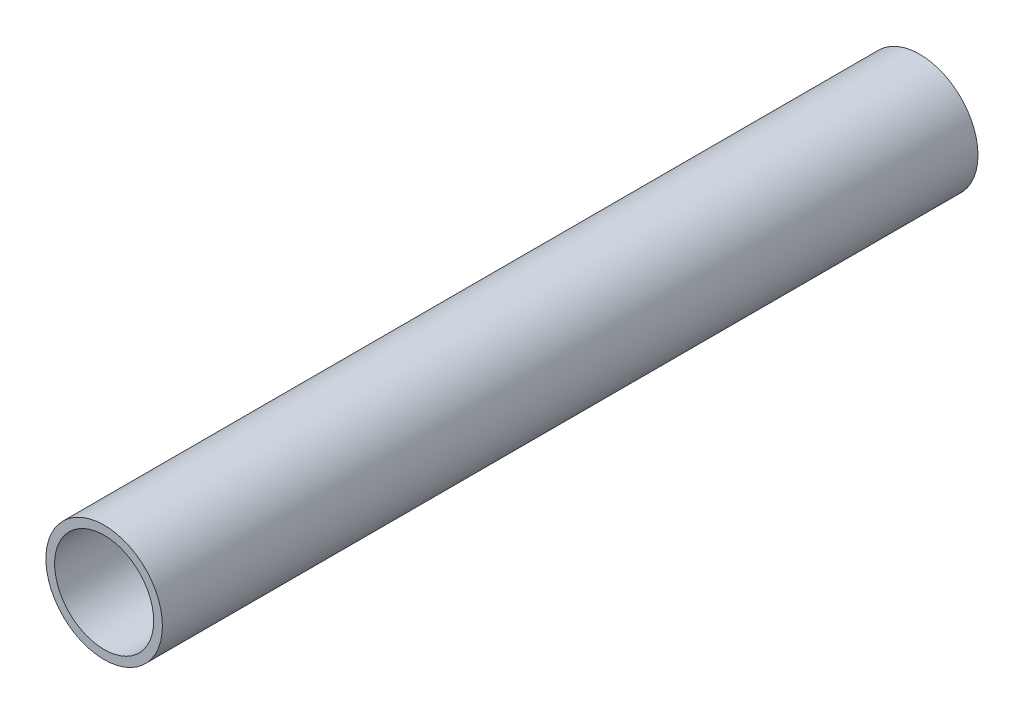
ISO-10303-21;
HEADER;
FILE_DESCRIPTION(('STEP AP214'),'2;1');
FILE_NAME('part.step','',(''),(''),'','','');
FILE_SCHEMA(('AUTOMOTIVE_DESIGN { 1 0 10303 214 1 1 1 1 }'));
ENDSEC;
DATA;
#1=APPLICATION_CONTEXT('core data for automotive mechanical design processes');
#2=APPLICATION_PROTOCOL_DEFINITION('international standard','automotive_design',2000,#1);
#3=PRODUCT_CONTEXT('',#1,'mechanical');
#4=PRODUCT('Part','Part','',(#3));
#5=PRODUCT_RELATED_PRODUCT_CATEGORY('part','',(#4));
#6=PRODUCT_DEFINITION_FORMATION('','',#4);
#7=PRODUCT_DEFINITION_CONTEXT('part definition',#1,'design');
#8=PRODUCT_DEFINITION('design','',#6,#7);
#9=PRODUCT_DEFINITION_SHAPE('','',#8);
#10=(LENGTH_UNIT() NAMED_UNIT(*) SI_UNIT(.MILLI.,.METRE.));
#11=(NAMED_UNIT(*) PLANE_ANGLE_UNIT() SI_UNIT($,.RADIAN.));
#12=(NAMED_UNIT(*) SI_UNIT($,.STERADIAN.) SOLID_ANGLE_UNIT());
#13=UNCERTAINTY_MEASURE_WITH_UNIT(LENGTH_MEASURE(1.E-05),#10,'distance_accuracy_value','');
#14=(GEOMETRIC_REPRESENTATION_CONTEXT(3) GLOBAL_UNCERTAINTY_ASSIGNED_CONTEXT((#13)) GLOBAL_UNIT_ASSIGNED_CONTEXT((#10,
#11,#12)) REPRESENTATION_CONTEXT('',''));
#15=CARTESIAN_POINT('',(0.,0.,0.));
#16=DIRECTION('',(0.,0.,1.));
#17=DIRECTION('',(1.,0.,0.));
#18=AXIS2_PLACEMENT_3D('',#15,#16,#17);
#19=CARTESIAN_POINT('',(0.,0.,140.));
#20=DIRECTION('',(0.,0.,1.));
#21=DIRECTION('',(1.,0.,0.));
#22=AXIS2_PLACEMENT_3D('',#19,#20,#21);
#23=PLANE('',#22);
#24=CARTESIAN_POINT('',(0.,0.,140.));
#25=DIRECTION('',(0.,0.,1.));
#26=DIRECTION('',(1.,0.,0.));
#27=AXIS2_PLACEMENT_3D('',#24,#25,#26);
#28=CIRCLE('',#27,10.);
#29=CARTESIAN_POINT('',(10.,0.,140.));
#30=VERTEX_POINT('',#29);
#31=EDGE_CURVE('E10',#30,#30,#28,.T.);
#32=ORIENTED_EDGE('',*,*,#31,.T.);
#33=EDGE_LOOP('',(#32));
#34=FACE_BOUND('',#33,.T.);
#35=CARTESIAN_POINT('',(0.,0.,140.));
#36=DIRECTION('',(0.,0.,1.));
#37=DIRECTION('',(1.,0.,0.));
#38=AXIS2_PLACEMENT_3D('',#35,#36,#37);
#39=CIRCLE('',#38,8.5);
#40=CARTESIAN_POINT('',(8.5,0.,140.));
#41=VERTEX_POINT('',#40);
#42=EDGE_CURVE('E42',#41,#41,#39,.T.);
#43=ORIENTED_EDGE('',*,*,#42,.F.);
#44=EDGE_LOOP('',(#43));
#45=FACE_BOUND('',#44,.T.);
#46=ADVANCED_FACE('F31',(#34,#45),#23,.T.);
#47=CARTESIAN_POINT('',(0.,0.,0.));
#48=DIRECTION('',(0.,0.,1.));
#49=DIRECTION('',(1.,0.,0.));
#50=AXIS2_PLACEMENT_3D('',#47,#48,#49);
#51=PLANE('',#50);
#52=CARTESIAN_POINT('',(0.,0.,0.));
#53=DIRECTION('',(0.,0.,1.));
#54=DIRECTION('',(1.,0.,0.));
#55=AXIS2_PLACEMENT_3D('',#52,#53,#54);
#56=CIRCLE('',#55,10.);
#57=CARTESIAN_POINT('',(10.,0.,0.));
#58=VERTEX_POINT('',#57);
#59=EDGE_CURVE('E35',#58,#58,#56,.T.);
#60=ORIENTED_EDGE('',*,*,#59,.F.);
#61=EDGE_LOOP('',(#60));
#62=FACE_BOUND('',#61,.T.);
#63=CARTESIAN_POINT('',(0.,0.,0.));
#64=DIRECTION('',(0.,0.,1.));
#65=DIRECTION('',(1.,0.,0.));
#66=AXIS2_PLACEMENT_3D('',#63,#64,#65);
#67=CIRCLE('',#66,8.5);
#68=CARTESIAN_POINT('',(8.5,0.,0.));
#69=VERTEX_POINT('',#68);
#70=EDGE_CURVE('E44',#69,#69,#67,.T.);
#71=ORIENTED_EDGE('',*,*,#70,.T.);
#72=EDGE_LOOP('',(#71));
#73=FACE_BOUND('',#72,.T.);
#74=ADVANCED_FACE('F54',(#62,#73),#51,.F.);
#75=CARTESIAN_POINT('',(0.,0.,140.));
#76=DIRECTION('',(0.,0.,-1.));
#77=DIRECTION('',(-1.,0.,0.));
#78=AXIS2_PLACEMENT_3D('',#75,#76,#77);
#79=CYLINDRICAL_SURFACE('',#78,10.);
#80=ORIENTED_EDGE('',*,*,#31,.F.);
#81=EDGE_LOOP('',(#80));
#82=FACE_BOUND('',#81,.T.);
#83=ORIENTED_EDGE('',*,*,#59,.T.);
#84=EDGE_LOOP('',(#83));
#85=FACE_BOUND('',#84,.T.);
#86=ADVANCED_FACE('F33',(#82,#85),#79,.T.);
#87=CARTESIAN_POINT('',(0.,0.,140.));
#88=DIRECTION('',(0.,0.,-1.));
#89=DIRECTION('',(-1.,0.,0.));
#90=AXIS2_PLACEMENT_3D('',#87,#88,#89);
#91=CYLINDRICAL_SURFACE('',#90,8.5);
#92=ORIENTED_EDGE('',*,*,#42,.T.);
#93=EDGE_LOOP('',(#92));
#94=FACE_BOUND('',#93,.T.);
#95=ORIENTED_EDGE('',*,*,#70,.F.);
#96=EDGE_LOOP('',(#95));
#97=FACE_BOUND('',#96,.T.);
#98=ADVANCED_FACE('F50',(#94,#97),#91,.F.);
#99=CLOSED_SHELL('',(#46,#74,#86,#98));
#100=MANIFOLD_SOLID_BREP('B2',#99);
#101=ADVANCED_BREP_SHAPE_REPRESENTATION('',(#18,#100),#14);
#102=SHAPE_DEFINITION_REPRESENTATION(#9,#101);
ENDSEC;
END-ISO-10303-21;
